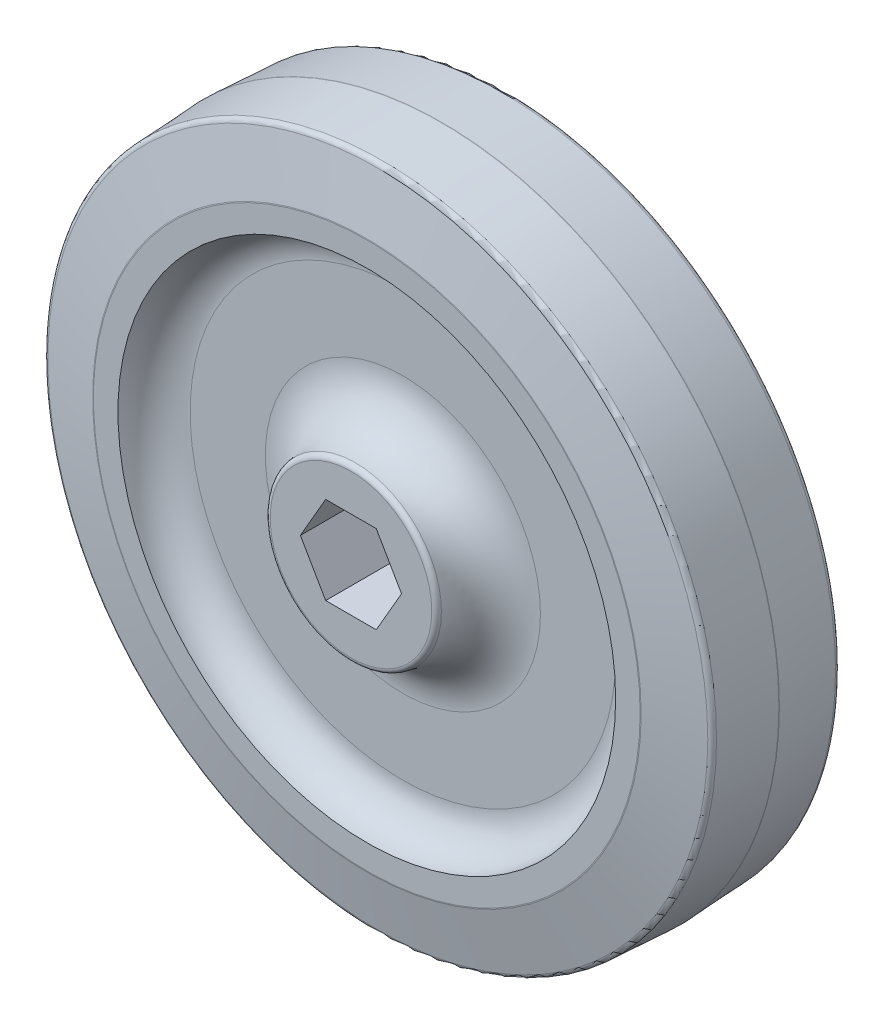
ISO-10303-21;
HEADER;
FILE_DESCRIPTION(('STEP AP214'),'2;1');
FILE_NAME('part.step','',(''),(''),'','','');
FILE_SCHEMA(('AUTOMOTIVE_DESIGN { 1 0 10303 214 1 1 1 1 }'));
ENDSEC;
DATA;
#1=APPLICATION_CONTEXT('core data for automotive mechanical design processes');
#2=APPLICATION_PROTOCOL_DEFINITION('international standard','automotive_design',2000,#1);
#3=PRODUCT_CONTEXT('',#1,'mechanical');
#4=PRODUCT('Part','Part','',(#3));
#5=PRODUCT_RELATED_PRODUCT_CATEGORY('part','',(#4));
#6=PRODUCT_DEFINITION_FORMATION('','',#4);
#7=PRODUCT_DEFINITION_CONTEXT('part definition',#1,'design');
#8=PRODUCT_DEFINITION('design','',#6,#7);
#9=PRODUCT_DEFINITION_SHAPE('','',#8);
#10=(LENGTH_UNIT() NAMED_UNIT(*) SI_UNIT(.MILLI.,.METRE.));
#11=(NAMED_UNIT(*) PLANE_ANGLE_UNIT() SI_UNIT($,.RADIAN.));
#12=(NAMED_UNIT(*) SI_UNIT($,.STERADIAN.) SOLID_ANGLE_UNIT());
#13=UNCERTAINTY_MEASURE_WITH_UNIT(LENGTH_MEASURE(1.E-05),#10,'distance_accuracy_value','');
#14=(GEOMETRIC_REPRESENTATION_CONTEXT(3) GLOBAL_UNCERTAINTY_ASSIGNED_CONTEXT((#13)) GLOBAL_UNIT_ASSIGNED_CONTEXT((#10,
#11,#12)) REPRESENTATION_CONTEXT('',''));
#15=CARTESIAN_POINT('',(0.,0.,0.));
#16=DIRECTION('',(0.,0.,1.));
#17=DIRECTION('',(1.,0.,0.));
#18=AXIS2_PLACEMENT_3D('',#15,#16,#17);
#19=CARTESIAN_POINT('',(0.,0.,-24.6499999999998));
#20=DIRECTION('',(0.,0.,1.));
#21=DIRECTION('',(1.,0.,0.));
#22=AXIS2_PLACEMENT_3D('',#19,#20,#21);
#23=CONICAL_SURFACE('',#22,40.6000000000001,1.37664399881685);
#24=CARTESIAN_POINT('',(0.,0.,-24.6359086756515));
#25=DIRECTION('',(0.,0.,-1.));
#26=DIRECTION('',(-1.,0.,0.));
#27=AXIS2_PLACEMENT_3D('',#24,#25,#26);
#28=CIRCLE('',#27,40.6716644495429);
#29=CARTESIAN_POINT('',(-40.6716644495429,0.,-24.6359086756514));
#30=VERTEX_POINT('',#29);
#31=EDGE_CURVE('E216',#30,#30,#28,.F.);
#32=ORIENTED_EDGE('',*,*,#31,.T.);
#33=EDGE_LOOP('',(#32));
#34=FACE_BOUND('',#33,.T.);
#35=CARTESIAN_POINT('',(0.,0.,-23.0127098776106));
#36=DIRECTION('',(0.,0.,-1.));
#37=DIRECTION('',(-1.,0.,0.));
#38=AXIS2_PLACEMENT_3D('',#35,#36,#37);
#39=CIRCLE('',#38,48.9267897652939);
#40=CARTESIAN_POINT('',(-48.926789765294,0.,-23.0127098776105));
#41=VERTEX_POINT('',#40);
#42=EDGE_CURVE('E214',#41,#41,#39,.T.);
#43=ORIENTED_EDGE('',*,*,#42,.T.);
#44=EDGE_LOOP('',(#43));
#45=FACE_BOUND('',#44,.T.);
#46=ADVANCED_FACE('F44',(#34,#45),#23,.T.);
#47=CARTESIAN_POINT('',(36.9,0.,-24.65));
#48=DIRECTION('',(0.,0.,1.));
#49=DIRECTION('',(1.,0.,0.));
#50=AXIS2_PLACEMENT_3D('',#47,#48,#49);
#51=PLANE('',#50);
#52=CARTESIAN_POINT('',(0.,0.,-24.6499999999999));
#53=DIRECTION('',(0.,0.,1.));
#54=DIRECTION('',(1.,0.,0.));
#55=AXIS2_PLACEMENT_3D('',#52,#53,#54);
#56=CIRCLE('',#55,40.5269633054541);
#57=CARTESIAN_POINT('',(40.526963305454,0.,-24.65));
#58=VERTEX_POINT('',#57);
#59=EDGE_CURVE('E221',#58,#58,#56,.F.);
#60=ORIENTED_EDGE('',*,*,#59,.T.);
#61=EDGE_LOOP('',(#60));
#62=FACE_BOUND('',#61,.T.);
#63=CARTESIAN_POINT('',(0.,0.,-24.6499999999999));
#64=DIRECTION('',(0.,0.,1.));
#65=DIRECTION('',(1.,0.,0.));
#66=AXIS2_PLACEMENT_3D('',#63,#64,#65);
#67=CIRCLE('',#66,36.9000000000001);
#68=CARTESIAN_POINT('',(36.9,0.,-24.65));
#69=VERTEX_POINT('',#68);
#70=EDGE_CURVE('E173',#69,#69,#67,.T.);
#71=ORIENTED_EDGE('',*,*,#70,.T.);
#72=EDGE_LOOP('',(#71));
#73=FACE_BOUND('',#72,.T.);
#74=ADVANCED_FACE('F264',(#62,#73),#51,.F.);
#75=CARTESIAN_POINT('',(12.7,0.,-19.3));
#76=DIRECTION('',(0.,0.,1.));
#77=DIRECTION('',(1.,0.,0.));
#78=AXIS2_PLACEMENT_3D('',#75,#76,#77);
#79=PLANE('',#78);
#80=CARTESIAN_POINT('',(0.,0.,-19.2999999999999));
#81=DIRECTION('',(0.,0.,1.));
#82=DIRECTION('',(1.,0.,0.));
#83=AXIS2_PLACEMENT_3D('',#80,#81,#82);
#84=CIRCLE('',#83,31.5500000000001);
#85=CARTESIAN_POINT('',(31.55,0.,-19.3));
#86=VERTEX_POINT('',#85);
#87=EDGE_CURVE('E186',#86,#86,#84,.F.);
#88=ORIENTED_EDGE('',*,*,#87,.T.);
#89=EDGE_LOOP('',(#88));
#90=FACE_BOUND('',#89,.T.);
#91=CARTESIAN_POINT('',(0.,0.,-19.2999999999999));
#92=DIRECTION('',(0.,0.,1.));
#93=DIRECTION('',(1.,0.,0.));
#94=AXIS2_PLACEMENT_3D('',#91,#92,#93);
#95=CIRCLE('',#94,20.4000000000001);
#96=CARTESIAN_POINT('',(20.4,0.,-19.3));
#97=VERTEX_POINT('',#96);
#98=EDGE_CURVE('E181',#97,#97,#95,.T.);
#99=ORIENTED_EDGE('',*,*,#98,.T.);
#100=EDGE_LOOP('',(#99));
#101=FACE_BOUND('',#100,.T.);
#102=ADVANCED_FACE('F269',(#90,#101),#79,.F.);
#103=CARTESIAN_POINT('',(0.,0.,-27.));
#104=DIRECTION('',(0.,0.,1.));
#105=DIRECTION('',(1.,0.,0.));
#106=AXIS2_PLACEMENT_3D('',#103,#104,#105);
#107=PLANE('',#106);
#108=DIRECTION('',(-0.5,0.866025403784439,0.));
#109=VECTOR('',#108,1.);
#110=CARTESIAN_POINT('',(7.5,0.,-27.));
#111=LINE('',#110,#109);
#112=CARTESIAN_POINT('',(7.5,0.,-27.));
#113=VERTEX_POINT('',#112);
#114=CARTESIAN_POINT('',(3.75,6.49519052838329,-27.));
#115=VERTEX_POINT('',#114);
#116=EDGE_CURVE('E108',#113,#115,#111,.T.);
#117=ORIENTED_EDGE('',*,*,#116,.T.);
#118=DIRECTION('',(-1.,0.,0.));
#119=VECTOR('',#118,1.);
#120=CARTESIAN_POINT('',(3.75,6.49519052838329,-27.));
#121=LINE('',#120,#119);
#122=CARTESIAN_POINT('',(-3.75,6.49519052838329,-27.));
#123=VERTEX_POINT('',#122);
#124=EDGE_CURVE('E103',#115,#123,#121,.T.);
#125=ORIENTED_EDGE('',*,*,#124,.T.);
#126=DIRECTION('',(-0.5,-0.866025403784439,0.));
#127=VECTOR('',#126,1.);
#128=CARTESIAN_POINT('',(-3.75,6.49519052838329,-27.));
#129=LINE('',#128,#127);
#130=CARTESIAN_POINT('',(-7.5,0.,-27.));
#131=VERTEX_POINT('',#130);
#132=EDGE_CURVE('E111',#123,#131,#129,.T.);
#133=ORIENTED_EDGE('',*,*,#132,.T.);
#134=DIRECTION('',(0.5,-0.866025403784439,0.));
#135=VECTOR('',#134,1.);
#136=CARTESIAN_POINT('',(-7.5,0.,-27.));
#137=LINE('',#136,#135);
#138=CARTESIAN_POINT('',(-3.75,-6.49519052838329,-27.));
#139=VERTEX_POINT('',#138);
#140=EDGE_CURVE('E62',#131,#139,#137,.T.);
#141=ORIENTED_EDGE('',*,*,#140,.T.);
#142=DIRECTION('',(1.,0.,0.));
#143=VECTOR('',#142,1.);
#144=CARTESIAN_POINT('',(-3.75,-6.49519052838329,-27.));
#145=LINE('',#144,#143);
#146=CARTESIAN_POINT('',(3.75,-6.49519052838329,-27.));
#147=VERTEX_POINT('',#146);
#148=EDGE_CURVE('E128',#139,#147,#145,.T.);
#149=ORIENTED_EDGE('',*,*,#148,.T.);
#150=DIRECTION('',(0.5,0.866025403784439,0.));
#151=VECTOR('',#150,1.);
#152=CARTESIAN_POINT('',(3.75,-6.49519052838329,-27.));
#153=LINE('',#152,#151);
#154=EDGE_CURVE('E133',#147,#113,#153,.T.);
#155=ORIENTED_EDGE('',*,*,#154,.T.);
#156=EDGE_LOOP('',(#117,#125,#133,#141,#149,#155));
#157=FACE_BOUND('',#156,.T.);
#158=CARTESIAN_POINT('',(0.,0.,-27.));
#159=DIRECTION('',(0.,0.,1.));
#160=DIRECTION('',(1.,0.,0.));
#161=AXIS2_PLACEMENT_3D('',#158,#159,#160);
#162=CIRCLE('',#161,11.9833498349997);
#163=CARTESIAN_POINT('',(11.9833498349997,0.,-27.));
#164=VERTEX_POINT('',#163);
#165=EDGE_CURVE('E11',#164,#164,#162,.F.);
#166=ORIENTED_EDGE('',*,*,#165,.T.);
#167=EDGE_LOOP('',(#166));
#168=FACE_BOUND('',#167,.T.);
#169=ADVANCED_FACE('F116',(#157,#168),#107,.F.);
#170=CARTESIAN_POINT('',(0.,0.,0.));
#171=DIRECTION('',(0.,0.,1.));
#172=DIRECTION('',(1.,0.,0.));
#173=AXIS2_PLACEMENT_3D('',#170,#171,#172);
#174=PLANE('',#173);
#175=DIRECTION('',(-1.,0.,0.));
#176=VECTOR('',#175,1.);
#177=CARTESIAN_POINT('',(3.75,6.49519052838329,0.));
#178=LINE('',#177,#176);
#179=CARTESIAN_POINT('',(3.75,6.49519052838329,0.));
#180=VERTEX_POINT('',#179);
#181=CARTESIAN_POINT('',(-3.75,6.49519052838329,0.));
#182=VERTEX_POINT('',#181);
#183=EDGE_CURVE('E68',#180,#182,#178,.T.);
#184=ORIENTED_EDGE('',*,*,#183,.F.);
#185=DIRECTION('',(-0.5,0.866025403784439,0.));
#186=VECTOR('',#185,1.);
#187=CARTESIAN_POINT('',(7.5,0.,0.));
#188=LINE('',#187,#186);
#189=CARTESIAN_POINT('',(7.5,0.,0.));
#190=VERTEX_POINT('',#189);
#191=EDGE_CURVE('E122',#190,#180,#188,.T.);
#192=ORIENTED_EDGE('',*,*,#191,.F.);
#193=DIRECTION('',(0.5,0.866025403784439,0.));
#194=VECTOR('',#193,1.);
#195=CARTESIAN_POINT('',(3.75,-6.49519052838329,0.));
#196=LINE('',#195,#194);
#197=CARTESIAN_POINT('',(3.75,-6.49519052838329,0.));
#198=VERTEX_POINT('',#197);
#199=EDGE_CURVE('E123',#198,#190,#196,.T.);
#200=ORIENTED_EDGE('',*,*,#199,.F.);
#201=DIRECTION('',(1.,0.,0.));
#202=VECTOR('',#201,1.);
#203=CARTESIAN_POINT('',(-3.75,-6.49519052838329,0.));
#204=LINE('',#203,#202);
#205=CARTESIAN_POINT('',(-3.75,-6.49519052838329,0.));
#206=VERTEX_POINT('',#205);
#207=EDGE_CURVE('E149',#206,#198,#204,.T.);
#208=ORIENTED_EDGE('',*,*,#207,.F.);
#209=DIRECTION('',(0.5,-0.866025403784439,0.));
#210=VECTOR('',#209,1.);
#211=CARTESIAN_POINT('',(-7.5,0.,0.));
#212=LINE('',#211,#210);
#213=CARTESIAN_POINT('',(-7.5,0.,0.));
#214=VERTEX_POINT('',#213);
#215=EDGE_CURVE('E144',#214,#206,#212,.T.);
#216=ORIENTED_EDGE('',*,*,#215,.F.);
#217=DIRECTION('',(-0.5,-0.866025403784439,0.));
#218=VECTOR('',#217,1.);
#219=CARTESIAN_POINT('',(-3.75,6.49519052838329,0.));
#220=LINE('',#219,#218);
#221=EDGE_CURVE('E142',#182,#214,#220,.T.);
#222=ORIENTED_EDGE('',*,*,#221,.F.);
#223=EDGE_LOOP('',(#184,#192,#200,#208,#216,#222));
#224=FACE_BOUND('',#223,.T.);
#225=CARTESIAN_POINT('',(0.,0.,0.));
#226=DIRECTION('',(0.,0.,1.));
#227=DIRECTION('',(1.,0.,0.));
#228=AXIS2_PLACEMENT_3D('',#225,#226,#227);
#229=CIRCLE('',#228,11.9833498349997);
#230=CARTESIAN_POINT('',(11.9833498349997,0.,0.));
#231=VERTEX_POINT('',#230);
#232=EDGE_CURVE('E205',#231,#231,#229,.T.);
#233=ORIENTED_EDGE('',*,*,#232,.T.);
#234=EDGE_LOOP('',(#233));
#235=FACE_BOUND('',#234,.T.);
#236=ADVANCED_FACE('F334',(#224,#235),#174,.T.);
#237=CARTESIAN_POINT('',(12.7,0.,-7.69999999999996));
#238=DIRECTION('',(0.,0.,1.));
#239=DIRECTION('',(1.,0.,0.));
#240=AXIS2_PLACEMENT_3D('',#237,#238,#239);
#241=PLANE('',#240);
#242=CARTESIAN_POINT('',(0.,0.,-7.69999999999991));
#243=DIRECTION('',(0.,0.,1.));
#244=DIRECTION('',(1.,0.,0.));
#245=AXIS2_PLACEMENT_3D('',#242,#243,#244);
#246=CIRCLE('',#245,31.55);
#247=CARTESIAN_POINT('',(31.55,0.,-7.70000000000002));
#248=VERTEX_POINT('',#247);
#249=EDGE_CURVE('E184',#248,#248,#246,.T.);
#250=ORIENTED_EDGE('',*,*,#249,.T.);
#251=EDGE_LOOP('',(#250));
#252=FACE_BOUND('',#251,.T.);
#253=CARTESIAN_POINT('',(0.,0.,-7.69999999999991));
#254=DIRECTION('',(0.,0.,1.));
#255=DIRECTION('',(1.,0.,0.));
#256=AXIS2_PLACEMENT_3D('',#253,#254,#255);
#257=CIRCLE('',#256,20.4);
#258=CARTESIAN_POINT('',(20.4,0.,-7.69999999999999));
#259=VERTEX_POINT('',#258);
#260=EDGE_CURVE('E180',#259,#259,#257,.F.);
#261=ORIENTED_EDGE('',*,*,#260,.T.);
#262=EDGE_LOOP('',(#261));
#263=FACE_BOUND('',#262,.T.);
#264=ADVANCED_FACE('F328',(#252,#263),#241,.T.);
#265=CARTESIAN_POINT('',(36.9,0.,-2.35));
#266=DIRECTION('',(0.,0.,1.));
#267=DIRECTION('',(1.,0.,0.));
#268=AXIS2_PLACEMENT_3D('',#265,#266,#267);
#269=PLANE('',#268);
#270=CARTESIAN_POINT('',(0.,0.,-2.34999999999987));
#271=DIRECTION('',(0.,0.,1.));
#272=DIRECTION('',(1.,0.,0.));
#273=AXIS2_PLACEMENT_3D('',#270,#271,#272);
#274=CIRCLE('',#273,40.5269633054543);
#275=CARTESIAN_POINT('',(40.5269633054542,0.,-2.35000000000001));
#276=VERTEX_POINT('',#275);
#277=EDGE_CURVE('E194',#276,#276,#274,.T.);
#278=ORIENTED_EDGE('',*,*,#277,.T.);
#279=EDGE_LOOP('',(#278));
#280=FACE_BOUND('',#279,.T.);
#281=CARTESIAN_POINT('',(0.,0.,-2.34999999999991));
#282=DIRECTION('',(0.,0.,1.));
#283=DIRECTION('',(1.,0.,0.));
#284=AXIS2_PLACEMENT_3D('',#281,#282,#283);
#285=CIRCLE('',#284,36.9);
#286=CARTESIAN_POINT('',(36.9,0.,-2.35000000000003));
#287=VERTEX_POINT('',#286);
#288=EDGE_CURVE('E159',#287,#287,#285,.T.);
#289=ORIENTED_EDGE('',*,*,#288,.F.);
#290=EDGE_LOOP('',(#289));
#291=FACE_BOUND('',#290,.T.);
#292=ADVANCED_FACE('F324',(#280,#291),#269,.T.);
#293=CARTESIAN_POINT('',(0.,0.,-2.34999999999985));
#294=DIRECTION('',(0.,0.,-1.));
#295=DIRECTION('',(-1.,0.,0.));
#296=AXIS2_PLACEMENT_3D('',#293,#294,#295);
#297=CONICAL_SURFACE('',#296,40.6,1.37664399881685);
#298=CARTESIAN_POINT('',(0.,0.,-2.3640913243482));
#299=DIRECTION('',(0.,0.,1.));
#300=DIRECTION('',(1.,0.,0.));
#301=AXIS2_PLACEMENT_3D('',#298,#299,#300);
#302=CIRCLE('',#301,40.6716644495431);
#303=CARTESIAN_POINT('',(40.671664449543,0.,-2.36409132434834));
#304=VERTEX_POINT('',#303);
#305=EDGE_CURVE('E201',#304,#304,#302,.F.);
#306=ORIENTED_EDGE('',*,*,#305,.T.);
#307=EDGE_LOOP('',(#306));
#308=FACE_BOUND('',#307,.T.);
#309=CARTESIAN_POINT('',(0.,0.,-3.98729012238907));
#310=DIRECTION('',(0.,0.,1.));
#311=DIRECTION('',(1.,0.,0.));
#312=AXIS2_PLACEMENT_3D('',#309,#310,#311);
#313=CIRCLE('',#312,48.9267897652939);
#314=CARTESIAN_POINT('',(48.9267897652938,0.,-3.98729012238923));
#315=VERTEX_POINT('',#314);
#316=EDGE_CURVE('E196',#315,#315,#313,.T.);
#317=ORIENTED_EDGE('',*,*,#316,.T.);
#318=EDGE_LOOP('',(#317));
#319=FACE_BOUND('',#318,.T.);
#320=ADVANCED_FACE('F313',(#308,#319),#297,.T.);
#321=CARTESIAN_POINT('',(0.,0.,-4.09999999999983));
#322=DIRECTION('',(0.,0.,-1.));
#323=DIRECTION('',(-1.,0.,0.));
#324=AXIS2_PLACEMENT_3D('',#321,#322,#323);
#325=CONICAL_SURFACE('',#324,49.5,0.0531414088449398);
#326=CARTESIAN_POINT('',(0.,0.,-4.68336149773774));
#327=DIRECTION('',(0.,0.,1.));
#328=DIRECTION('',(1.,0.,0.));
#329=AXIS2_PLACEMENT_3D('',#326,#327,#328);
#330=CIRCLE('',#329,49.531029866901);
#331=CARTESIAN_POINT('',(49.531029866901,0.,-4.68336149773791));
#332=VERTEX_POINT('',#331);
#333=EDGE_CURVE('E230',#332,#332,#330,.F.);
#334=ORIENTED_EDGE('',*,*,#333,.T.);
#335=EDGE_LOOP('',(#334));
#336=FACE_BOUND('',#335,.T.);
#337=CARTESIAN_POINT('',(0.,0.,-13.4601626996969));
#338=DIRECTION('',(0.,0.,-1.));
#339=DIRECTION('',(-1.,0.,0.));
#340=AXIS2_PLACEMENT_3D('',#337,#338,#339);
#341=CIRCLE('',#340,49.9978809946648);
#342=CARTESIAN_POINT('',(-49.9978809946648,0.,-13.4601626996967));
#343=VERTEX_POINT('',#342);
#344=EDGE_CURVE('E225',#343,#343,#341,.F.);
#345=ORIENTED_EDGE('',*,*,#344,.T.);
#346=EDGE_LOOP('',(#345));
#347=FACE_BOUND('',#346,.T.);
#348=ADVANCED_FACE('F315',(#336,#347),#325,.T.);
#349=CARTESIAN_POINT('',(0.,0.,-22.8999999999999));
#350=DIRECTION('',(0.,0.,1.));
#351=DIRECTION('',(1.,0.,0.));
#352=AXIS2_PLACEMENT_3D('',#349,#350,#351);
#353=CONICAL_SURFACE('',#352,49.5000000000001,0.0531414088449332);
#354=CARTESIAN_POINT('',(0.,0.,-13.5398373003028));
#355=DIRECTION('',(0.,0.,1.));
#356=DIRECTION('',(1.,0.,0.));
#357=AXIS2_PLACEMENT_3D('',#354,#355,#356);
#358=CIRCLE('',#357,49.9978809946648);
#359=CARTESIAN_POINT('',(49.9978809946647,0.,-13.539837300303));
#360=VERTEX_POINT('',#359);
#361=EDGE_CURVE('E240',#360,#360,#358,.F.);
#362=ORIENTED_EDGE('',*,*,#361,.T.);
#363=EDGE_LOOP('',(#362));
#364=FACE_BOUND('',#363,.T.);
#365=CARTESIAN_POINT('',(0.,0.,-22.3166385022621));
#366=DIRECTION('',(0.,0.,-1.));
#367=DIRECTION('',(-1.,0.,0.));
#368=AXIS2_PLACEMENT_3D('',#365,#366,#367);
#369=CIRCLE('',#368,49.531029866901);
#370=CARTESIAN_POINT('',(-49.5310298669011,0.,-22.3166385022619));
#371=VERTEX_POINT('',#370);
#372=EDGE_CURVE('E231',#371,#371,#369,.F.);
#373=ORIENTED_EDGE('',*,*,#372,.T.);
#374=EDGE_LOOP('',(#373));
#375=FACE_BOUND('',#374,.T.);
#376=ADVANCED_FACE('F280',(#364,#375),#353,.T.);
#377=CARTESIAN_POINT('',(0.,0.,1.11022302462516E-13));
#378=DIRECTION('',(0.,0.,1.));
#379=DIRECTION('',(1.,0.,0.));
#380=AXIS2_PLACEMENT_3D('',#377,#378,#379);
#381=TOROIDAL_SURFACE('',#380,20.4,7.7);
#382=CARTESIAN_POINT('',(0.,0.,-0.683431952662692));
#383=DIRECTION('',(0.,0.,1.));
#384=DIRECTION('',(1.,0.,0.));
#385=AXIS2_PLACEMENT_3D('',#382,#383,#384);
#386=CIRCLE('',#385,12.7303897904731);
#387=CARTESIAN_POINT('',(12.7303897904731,0.,-0.683431952662736));
#388=VERTEX_POINT('',#387);
#389=EDGE_CURVE('E209',#388,#388,#386,.F.);
#390=ORIENTED_EDGE('',*,*,#389,.T.);
#391=EDGE_LOOP('',(#390));
#392=FACE_BOUND('',#391,.T.);
#393=ORIENTED_EDGE('',*,*,#260,.F.);
#394=EDGE_LOOP('',(#393));
#395=FACE_BOUND('',#394,.T.);
#396=ADVANCED_FACE('F274',(#392,#395),#381,.F.);
#397=CARTESIAN_POINT('',(0.,0.,-26.9999999999999));
#398=DIRECTION('',(0.,0.,1.));
#399=DIRECTION('',(1.,0.,0.));
#400=AXIS2_PLACEMENT_3D('',#397,#398,#399);
#401=TOROIDAL_SURFACE('',#400,20.4000000000001,7.7);
#402=CARTESIAN_POINT('',(0.,0.,-26.3165680473372));
#403=DIRECTION('',(0.,0.,-1.));
#404=DIRECTION('',(-1.,0.,0.));
#405=AXIS2_PLACEMENT_3D('',#402,#403,#404);
#406=CIRCLE('',#405,12.7303897904732);
#407=CARTESIAN_POINT('',(-12.7303897904732,0.,-26.3165680473372));
#408=VERTEX_POINT('',#407);
#409=EDGE_CURVE('E53',#408,#408,#406,.F.);
#410=ORIENTED_EDGE('',*,*,#409,.T.);
#411=EDGE_LOOP('',(#410));
#412=FACE_BOUND('',#411,.T.);
#413=ORIENTED_EDGE('',*,*,#98,.F.);
#414=EDGE_LOOP('',(#413));
#415=FACE_BOUND('',#414,.T.);
#416=ADVANCED_FACE('F242',(#412,#415),#401,.F.);
#417=CARTESIAN_POINT('',(0.,0.,-2.34999999999991));
#418=DIRECTION('',(0.,0.,1.));
#419=DIRECTION('',(1.,0.,0.));
#420=AXIS2_PLACEMENT_3D('',#417,#418,#419);
#421=TOROIDAL_SURFACE('',#420,31.55,5.35);
#422=ORIENTED_EDGE('',*,*,#288,.T.);
#423=EDGE_LOOP('',(#422));
#424=FACE_BOUND('',#423,.T.);
#425=ORIENTED_EDGE('',*,*,#249,.F.);
#426=EDGE_LOOP('',(#425));
#427=FACE_BOUND('',#426,.T.);
#428=ADVANCED_FACE('F284',(#424,#427),#421,.F.);
#429=CARTESIAN_POINT('',(0.,0.,-24.6499999999999));
#430=DIRECTION('',(0.,0.,1.));
#431=DIRECTION('',(1.,0.,0.));
#432=AXIS2_PLACEMENT_3D('',#429,#430,#431);
#433=TOROIDAL_SURFACE('',#432,31.5500000000001,5.35);
#434=ORIENTED_EDGE('',*,*,#87,.F.);
#435=EDGE_LOOP('',(#434));
#436=FACE_BOUND('',#435,.T.);
#437=ORIENTED_EDGE('',*,*,#70,.F.);
#438=EDGE_LOOP('',(#437));
#439=FACE_BOUND('',#438,.T.);
#440=ADVANCED_FACE('F283',(#436,#439),#433,.F.);
#441=CARTESIAN_POINT('',(0.,0.,-3.09999999999987));
#442=DIRECTION('',(0.,0.,1.));
#443=DIRECTION('',(1.,0.,0.));
#444=AXIS2_PLACEMENT_3D('',#441,#442,#443);
#445=TOROIDAL_SURFACE('',#444,40.5269633054543,0.75);
#446=ORIENTED_EDGE('',*,*,#305,.F.);
#447=EDGE_LOOP('',(#446));
#448=FACE_BOUND('',#447,.T.);
#449=ORIENTED_EDGE('',*,*,#277,.F.);
#450=EDGE_LOOP('',(#449));
#451=FACE_BOUND('',#450,.T.);
#452=ADVANCED_FACE('F287',(#448,#451),#445,.T.);
#453=CARTESIAN_POINT('',(0.,0.,-0.749999999999978));
#454=DIRECTION('',(0.,0.,-1.));
#455=DIRECTION('',(-1.,0.,0.));
#456=AXIS2_PLACEMENT_3D('',#453,#454,#455);
#457=TOROIDAL_SURFACE('',#456,11.9833498349997,0.75);
#458=ORIENTED_EDGE('',*,*,#389,.F.);
#459=EDGE_LOOP('',(#458));
#460=FACE_BOUND('',#459,.T.);
#461=ORIENTED_EDGE('',*,*,#232,.F.);
#462=EDGE_LOOP('',(#461));
#463=FACE_BOUND('',#462,.T.);
#464=ADVANCED_FACE('F293',(#460,#463),#457,.T.);
#465=CARTESIAN_POINT('',(0.,0.,-23.8999999999999));
#466=DIRECTION('',(0.,0.,1.));
#467=DIRECTION('',(1.,0.,0.));
#468=AXIS2_PLACEMENT_3D('',#465,#466,#467);
#469=TOROIDAL_SURFACE('',#468,40.5269633054541,0.75);
#470=ORIENTED_EDGE('',*,*,#59,.F.);
#471=EDGE_LOOP('',(#470));
#472=FACE_BOUND('',#471,.T.);
#473=ORIENTED_EDGE('',*,*,#31,.F.);
#474=EDGE_LOOP('',(#473));
#475=FACE_BOUND('',#474,.T.);
#476=ADVANCED_FACE('F294',(#472,#475),#469,.T.);
#477=CARTESIAN_POINT('',(0.,0.,-4.72319879804073));
#478=DIRECTION('',(0.,0.,-1.));
#479=DIRECTION('',(-1.,0.,0.));
#480=AXIS2_PLACEMENT_3D('',#477,#478,#479);
#481=TOROIDAL_SURFACE('',#480,48.782088621205,0.75);
#482=ORIENTED_EDGE('',*,*,#333,.F.);
#483=EDGE_LOOP('',(#482));
#484=FACE_BOUND('',#483,.T.);
#485=ORIENTED_EDGE('',*,*,#316,.F.);
#486=EDGE_LOOP('',(#485));
#487=FACE_BOUND('',#486,.T.);
#488=ADVANCED_FACE('F299',(#484,#487),#481,.T.);
#489=CARTESIAN_POINT('',(0.,0.,-13.4999999999999));
#490=DIRECTION('',(0.,0.,-1.));
#491=DIRECTION('',(-1.,0.,0.));
#492=AXIS2_PLACEMENT_3D('',#489,#490,#491);
#493=TOROIDAL_SURFACE('',#492,49.2489397489689,0.75);
#494=ORIENTED_EDGE('',*,*,#361,.F.);
#495=EDGE_LOOP('',(#494));
#496=FACE_BOUND('',#495,.T.);
#497=ORIENTED_EDGE('',*,*,#344,.F.);
#498=EDGE_LOOP('',(#497));
#499=FACE_BOUND('',#498,.T.);
#500=ADVANCED_FACE('F260',(#496,#499),#493,.T.);
#501=CARTESIAN_POINT('',(0.,0.,-22.276801201959));
#502=DIRECTION('',(0.,0.,-1.));
#503=DIRECTION('',(-1.,0.,0.));
#504=AXIS2_PLACEMENT_3D('',#501,#502,#503);
#505=TOROIDAL_SURFACE('',#504,48.7820886212051,0.75);
#506=ORIENTED_EDGE('',*,*,#42,.F.);
#507=EDGE_LOOP('',(#506));
#508=FACE_BOUND('',#507,.T.);
#509=ORIENTED_EDGE('',*,*,#372,.F.);
#510=EDGE_LOOP('',(#509));
#511=FACE_BOUND('',#510,.T.);
#512=ADVANCED_FACE('F247',(#508,#511),#505,.T.);
#513=CARTESIAN_POINT('',(0.,0.,-26.25));
#514=DIRECTION('',(0.,0.,-1.));
#515=DIRECTION('',(-1.,0.,0.));
#516=AXIS2_PLACEMENT_3D('',#513,#514,#515);
#517=TOROIDAL_SURFACE('',#516,11.9833498349997,0.75);
#518=ORIENTED_EDGE('',*,*,#165,.F.);
#519=EDGE_LOOP('',(#518));
#520=FACE_BOUND('',#519,.T.);
#521=ORIENTED_EDGE('',*,*,#409,.F.);
#522=EDGE_LOOP('',(#521));
#523=FACE_BOUND('',#522,.T.);
#524=ADVANCED_FACE('F50',(#520,#523),#517,.T.);
#525=CARTESIAN_POINT('',(3.75,6.49519052838329,-27.));
#526=DIRECTION('',(0.,1.,0.));
#527=DIRECTION('',(-1.,0.,0.));
#528=AXIS2_PLACEMENT_3D('',#525,#526,#527);
#529=PLANE('',#528);
#530=ORIENTED_EDGE('',*,*,#183,.T.);
#531=DIRECTION('',(0.,0.,1.));
#532=VECTOR('',#531,1.);
#533=CARTESIAN_POINT('',(-3.75,6.49519052838329,-27.));
#534=LINE('',#533,#532);
#535=EDGE_CURVE('E97',#123,#182,#534,.T.);
#536=ORIENTED_EDGE('',*,*,#535,.F.);
#537=ORIENTED_EDGE('',*,*,#124,.F.);
#538=DIRECTION('',(0.,0.,1.));
#539=VECTOR('',#538,1.);
#540=CARTESIAN_POINT('',(3.75,6.49519052838329,-27.));
#541=LINE('',#540,#539);
#542=EDGE_CURVE('E152',#115,#180,#541,.T.);
#543=ORIENTED_EDGE('',*,*,#542,.T.);
#544=EDGE_LOOP('',(#530,#536,#537,#543));
#545=FACE_BOUND('',#544,.T.);
#546=ADVANCED_FACE('F100',(#545),#529,.F.);
#547=CARTESIAN_POINT('',(7.5,0.,-27.));
#548=DIRECTION('',(0.866025403784439,0.5,0.));
#549=DIRECTION('',(-0.5,0.866025403784439,0.));
#550=AXIS2_PLACEMENT_3D('',#547,#548,#549);
#551=PLANE('',#550);
#552=ORIENTED_EDGE('',*,*,#191,.T.);
#553=ORIENTED_EDGE('',*,*,#542,.F.);
#554=ORIENTED_EDGE('',*,*,#116,.F.);
#555=DIRECTION('',(0.,0.,1.));
#556=VECTOR('',#555,1.);
#557=CARTESIAN_POINT('',(7.5,0.,-27.));
#558=LINE('',#557,#556);
#559=EDGE_CURVE('E158',#113,#190,#558,.T.);
#560=ORIENTED_EDGE('',*,*,#559,.T.);
#561=EDGE_LOOP('',(#552,#553,#554,#560));
#562=FACE_BOUND('',#561,.T.);
#563=ADVANCED_FACE('F253',(#562),#551,.F.);
#564=CARTESIAN_POINT('',(3.75,-6.49519052838329,-27.));
#565=DIRECTION('',(0.866025403784439,-0.5,0.));
#566=DIRECTION('',(0.5,0.866025403784439,0.));
#567=AXIS2_PLACEMENT_3D('',#564,#565,#566);
#568=PLANE('',#567);
#569=ORIENTED_EDGE('',*,*,#199,.T.);
#570=ORIENTED_EDGE('',*,*,#559,.F.);
#571=ORIENTED_EDGE('',*,*,#154,.F.);
#572=DIRECTION('',(0.,0.,1.));
#573=VECTOR('',#572,1.);
#574=CARTESIAN_POINT('',(3.75,-6.49519052838329,-27.));
#575=LINE('',#574,#573);
#576=EDGE_CURVE('E162',#147,#198,#575,.T.);
#577=ORIENTED_EDGE('',*,*,#576,.T.);
#578=EDGE_LOOP('',(#569,#570,#571,#577));
#579=FACE_BOUND('',#578,.T.);
#580=ADVANCED_FACE('F422',(#579),#568,.F.);
#581=CARTESIAN_POINT('',(-3.75,-6.49519052838329,-27.));
#582=DIRECTION('',(0.,-1.,0.));
#583=DIRECTION('',(1.,0.,0.));
#584=AXIS2_PLACEMENT_3D('',#581,#582,#583);
#585=PLANE('',#584);
#586=ORIENTED_EDGE('',*,*,#207,.T.);
#587=ORIENTED_EDGE('',*,*,#576,.F.);
#588=ORIENTED_EDGE('',*,*,#148,.F.);
#589=DIRECTION('',(0.,0.,1.));
#590=VECTOR('',#589,1.);
#591=CARTESIAN_POINT('',(-3.75,-6.49519052838329,-27.));
#592=LINE('',#591,#590);
#593=EDGE_CURVE('E164',#139,#206,#592,.T.);
#594=ORIENTED_EDGE('',*,*,#593,.T.);
#595=EDGE_LOOP('',(#586,#587,#588,#594));
#596=FACE_BOUND('',#595,.T.);
#597=ADVANCED_FACE('F435',(#596),#585,.F.);
#598=CARTESIAN_POINT('',(-7.5,0.,-27.));
#599=DIRECTION('',(-0.866025403784439,-0.5,0.));
#600=DIRECTION('',(0.5,-0.866025403784439,0.));
#601=AXIS2_PLACEMENT_3D('',#598,#599,#600);
#602=PLANE('',#601);
#603=ORIENTED_EDGE('',*,*,#215,.T.);
#604=ORIENTED_EDGE('',*,*,#593,.F.);
#605=ORIENTED_EDGE('',*,*,#140,.F.);
#606=DIRECTION('',(0.,0.,1.));
#607=VECTOR('',#606,1.);
#608=CARTESIAN_POINT('',(-7.5,0.,-27.));
#609=LINE('',#608,#607);
#610=EDGE_CURVE('E110',#131,#214,#609,.T.);
#611=ORIENTED_EDGE('',*,*,#610,.T.);
#612=EDGE_LOOP('',(#603,#604,#605,#611));
#613=FACE_BOUND('',#612,.T.);
#614=ADVANCED_FACE('F445',(#613),#602,.F.);
#615=CARTESIAN_POINT('',(-3.75,6.49519052838329,-27.));
#616=DIRECTION('',(-0.866025403784439,0.5,0.));
#617=DIRECTION('',(-0.5,-0.866025403784439,0.));
#618=AXIS2_PLACEMENT_3D('',#615,#616,#617);
#619=PLANE('',#618);
#620=ORIENTED_EDGE('',*,*,#221,.T.);
#621=ORIENTED_EDGE('',*,*,#610,.F.);
#622=ORIENTED_EDGE('',*,*,#132,.F.);
#623=ORIENTED_EDGE('',*,*,#535,.T.);
#624=EDGE_LOOP('',(#620,#621,#622,#623));
#625=FACE_BOUND('',#624,.T.);
#626=ADVANCED_FACE('F115',(#625),#619,.F.);
#627=CLOSED_SHELL('',(#46,#74,#102,#169,#236,#264,#292,#320,#348,#376,#396,#416,#428,#440,#452,
#464,#476,#488,#500,#512,#524,#546,#563,#580,#597,#614,#626));
#628=MANIFOLD_SOLID_BREP('B2',#627);
#629=ADVANCED_BREP_SHAPE_REPRESENTATION('',(#18,#628),#14);
#630=SHAPE_DEFINITION_REPRESENTATION(#9,#629);
ENDSEC;
END-ISO-10303-21;
